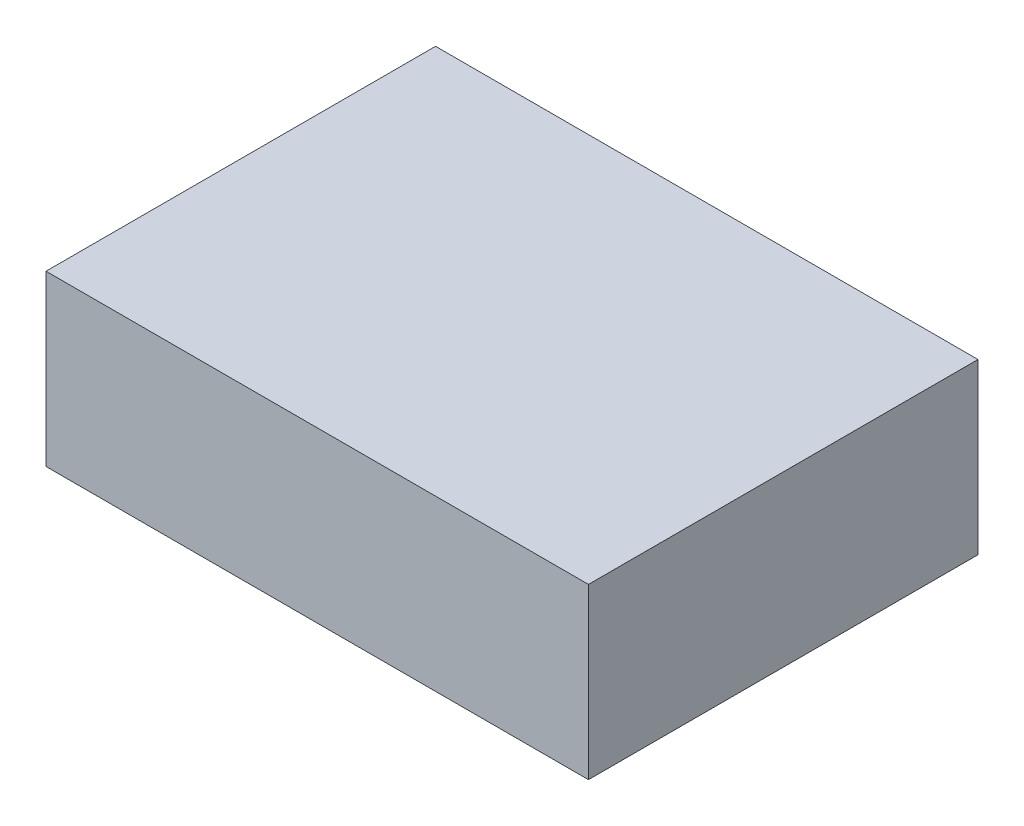
ISO-10303-21;
HEADER;
FILE_DESCRIPTION(('STEP AP214'),'2;1');
FILE_NAME('part.step','',(''),(''),'','','');
FILE_SCHEMA(('AUTOMOTIVE_DESIGN { 1 0 10303 214 1 1 1 1 }'));
ENDSEC;
DATA;
#1=APPLICATION_CONTEXT('core data for automotive mechanical design processes');
#2=APPLICATION_PROTOCOL_DEFINITION('international standard','automotive_design',2000,#1);
#3=PRODUCT_CONTEXT('',#1,'mechanical');
#4=PRODUCT('Part','Part','',(#3));
#5=PRODUCT_RELATED_PRODUCT_CATEGORY('part','',(#4));
#6=PRODUCT_DEFINITION_FORMATION('','',#4);
#7=PRODUCT_DEFINITION_CONTEXT('part definition',#1,'design');
#8=PRODUCT_DEFINITION('design','',#6,#7);
#9=PRODUCT_DEFINITION_SHAPE('','',#8);
#10=(LENGTH_UNIT() NAMED_UNIT(*) SI_UNIT(.MILLI.,.METRE.));
#11=(NAMED_UNIT(*) PLANE_ANGLE_UNIT() SI_UNIT($,.RADIAN.));
#12=(NAMED_UNIT(*) SI_UNIT($,.STERADIAN.) SOLID_ANGLE_UNIT());
#13=UNCERTAINTY_MEASURE_WITH_UNIT(LENGTH_MEASURE(1.E-05),#10,'distance_accuracy_value','');
#14=(GEOMETRIC_REPRESENTATION_CONTEXT(3) GLOBAL_UNCERTAINTY_ASSIGNED_CONTEXT((#13)) GLOBAL_UNIT_ASSIGNED_CONTEXT((#10,
#11,#12)) REPRESENTATION_CONTEXT('',''));
#15=CARTESIAN_POINT('',(0.,0.,0.));
#16=DIRECTION('',(0.,0.,1.));
#17=DIRECTION('',(1.,0.,0.));
#18=AXIS2_PLACEMENT_3D('',#15,#16,#17);
#19=CARTESIAN_POINT('',(-57.7292450853398,45.466,-46.6022930847641));
#20=DIRECTION('',(1.,0.,0.));
#21=DIRECTION('',(0.,0.,-1.));
#22=AXIS2_PLACEMENT_3D('',#19,#20,#21);
#23=PLANE('',#22);
#24=DIRECTION('',(0.,0.,1.));
#25=VECTOR('',#24,1.);
#26=CARTESIAN_POINT('',(-57.7292450853398,0.,-46.6022930847641));
#27=LINE('',#26,#25);
#28=CARTESIAN_POINT('',(-57.7292450853398,0.,-46.6022930847641));
#29=VERTEX_POINT('',#28);
#30=CARTESIAN_POINT('',(-57.7292450853398,0.,58.1219610383013));
#31=VERTEX_POINT('',#30);
#32=EDGE_CURVE('E101',#29,#31,#27,.T.);
#33=ORIENTED_EDGE('',*,*,#32,.T.);
#34=DIRECTION('',(0.,-1.,0.));
#35=VECTOR('',#34,1.);
#36=CARTESIAN_POINT('',(-57.7292450853398,45.466,58.1219610383013));
#37=LINE('',#36,#35);
#38=CARTESIAN_POINT('',(-57.7292450853398,45.466,58.1219610383013));
#39=VERTEX_POINT('',#38);
#40=EDGE_CURVE('E11',#39,#31,#37,.T.);
#41=ORIENTED_EDGE('',*,*,#40,.F.);
#42=DIRECTION('',(0.,0.,1.));
#43=VECTOR('',#42,1.);
#44=CARTESIAN_POINT('',(-57.7292450853398,45.466,-46.6022930847641));
#45=LINE('',#44,#43);
#46=CARTESIAN_POINT('',(-57.7292450853398,45.466,-46.6022930847641));
#47=VERTEX_POINT('',#46);
#48=EDGE_CURVE('E89',#47,#39,#45,.T.);
#49=ORIENTED_EDGE('',*,*,#48,.F.);
#50=DIRECTION('',(0.,-1.,0.));
#51=VECTOR('',#50,1.);
#52=CARTESIAN_POINT('',(-57.7292450853398,45.466,-46.6022930847641));
#53=LINE('',#52,#51);
#54=EDGE_CURVE('E97',#47,#29,#53,.T.);
#55=ORIENTED_EDGE('',*,*,#54,.T.);
#56=EDGE_LOOP('',(#33,#41,#49,#55));
#57=FACE_BOUND('',#56,.T.);
#58=ADVANCED_FACE('F38',(#57),#23,.F.);
#59=CARTESIAN_POINT('',(-57.7292450853398,45.466,58.1219610383013));
#60=DIRECTION('',(0.,0.,-1.));
#61=DIRECTION('',(-1.,0.,0.));
#62=AXIS2_PLACEMENT_3D('',#59,#60,#61);
#63=PLANE('',#62);
#64=DIRECTION('',(1.,0.,0.));
#65=VECTOR('',#64,1.);
#66=CARTESIAN_POINT('',(-57.7292450853398,0.,58.1219610383013));
#67=LINE('',#66,#65);
#68=CARTESIAN_POINT('',(88.0992787810288,0.,58.1219610383013));
#69=VERTEX_POINT('',#68);
#70=EDGE_CURVE('E93',#31,#69,#67,.T.);
#71=ORIENTED_EDGE('',*,*,#70,.T.);
#72=DIRECTION('',(0.,-1.,0.));
#73=VECTOR('',#72,1.);
#74=CARTESIAN_POINT('',(88.0992787810288,45.466,58.1219610383013));
#75=LINE('',#74,#73);
#76=CARTESIAN_POINT('',(88.0992787810288,45.466,58.1219610383013));
#77=VERTEX_POINT('',#76);
#78=EDGE_CURVE('E46',#77,#69,#75,.T.);
#79=ORIENTED_EDGE('',*,*,#78,.F.);
#80=DIRECTION('',(1.,0.,0.));
#81=VECTOR('',#80,1.);
#82=CARTESIAN_POINT('',(-57.7292450853398,45.466,58.1219610383013));
#83=LINE('',#82,#81);
#84=EDGE_CURVE('E84',#39,#77,#83,.T.);
#85=ORIENTED_EDGE('',*,*,#84,.F.);
#86=ORIENTED_EDGE('',*,*,#40,.T.);
#87=EDGE_LOOP('',(#71,#79,#85,#86));
#88=FACE_BOUND('',#87,.T.);
#89=ADVANCED_FACE('F92',(#88),#63,.F.);
#90=CARTESIAN_POINT('',(88.0992787810288,45.466,-46.6022930847641));
#91=DIRECTION('',(-1.,0.,0.));
#92=DIRECTION('',(0.,0.,1.));
#93=AXIS2_PLACEMENT_3D('',#90,#91,#92);
#94=PLANE('',#93);
#95=DIRECTION('',(0.,0.,-1.));
#96=VECTOR('',#95,1.);
#97=CARTESIAN_POINT('',(88.0992787810288,0.,-46.6022930847641));
#98=LINE('',#97,#96);
#99=CARTESIAN_POINT('',(88.0992787810288,0.,-46.6022930847641));
#100=VERTEX_POINT('',#99);
#101=EDGE_CURVE('E71',#69,#100,#98,.T.);
#102=ORIENTED_EDGE('',*,*,#101,.T.);
#103=DIRECTION('',(0.,-1.,0.));
#104=VECTOR('',#103,1.);
#105=CARTESIAN_POINT('',(88.0992787810288,45.466,-46.6022930847641));
#106=LINE('',#105,#104);
#107=CARTESIAN_POINT('',(88.0992787810288,45.466,-46.6022930847641));
#108=VERTEX_POINT('',#107);
#109=EDGE_CURVE('E94',#108,#100,#106,.T.);
#110=ORIENTED_EDGE('',*,*,#109,.F.);
#111=DIRECTION('',(0.,0.,-1.));
#112=VECTOR('',#111,1.);
#113=CARTESIAN_POINT('',(88.0992787810288,45.466,-46.6022930847641));
#114=LINE('',#113,#112);
#115=EDGE_CURVE('E87',#77,#108,#114,.T.);
#116=ORIENTED_EDGE('',*,*,#115,.F.);
#117=ORIENTED_EDGE('',*,*,#78,.T.);
#118=EDGE_LOOP('',(#102,#110,#116,#117));
#119=FACE_BOUND('',#118,.T.);
#120=ADVANCED_FACE('F95',(#119),#94,.F.);
#121=CARTESIAN_POINT('',(-57.7292450853398,45.466,-46.6022930847641));
#122=DIRECTION('',(0.,0.,1.));
#123=DIRECTION('',(1.,0.,0.));
#124=AXIS2_PLACEMENT_3D('',#121,#122,#123);
#125=PLANE('',#124);
#126=DIRECTION('',(-1.,0.,0.));
#127=VECTOR('',#126,1.);
#128=CARTESIAN_POINT('',(-57.7292450853398,0.,-46.6022930847641));
#129=LINE('',#128,#127);
#130=EDGE_CURVE('E77',#100,#29,#129,.T.);
#131=ORIENTED_EDGE('',*,*,#130,.T.);
#132=ORIENTED_EDGE('',*,*,#54,.F.);
#133=DIRECTION('',(-1.,0.,0.));
#134=VECTOR('',#133,1.);
#135=CARTESIAN_POINT('',(-57.7292450853398,45.466,-46.6022930847641));
#136=LINE('',#135,#134);
#137=EDGE_CURVE('E54',#108,#47,#136,.T.);
#138=ORIENTED_EDGE('',*,*,#137,.F.);
#139=ORIENTED_EDGE('',*,*,#109,.T.);
#140=EDGE_LOOP('',(#131,#132,#138,#139));
#141=FACE_BOUND('',#140,.T.);
#142=ADVANCED_FACE('F108',(#141),#125,.F.);
#143=CARTESIAN_POINT('',(0.,45.466,0.));
#144=DIRECTION('',(0.,1.,0.));
#145=DIRECTION('',(0.,0.,1.));
#146=AXIS2_PLACEMENT_3D('',#143,#144,#145);
#147=PLANE('',#146);
#148=ORIENTED_EDGE('',*,*,#48,.T.);
#149=ORIENTED_EDGE('',*,*,#84,.T.);
#150=ORIENTED_EDGE('',*,*,#115,.T.);
#151=ORIENTED_EDGE('',*,*,#137,.T.);
#152=EDGE_LOOP('',(#148,#149,#150,#151));
#153=FACE_BOUND('',#152,.T.);
#154=ADVANCED_FACE('F85',(#153),#147,.T.);
#155=CARTESIAN_POINT('',(0.,0.,0.));
#156=DIRECTION('',(0.,1.,0.));
#157=DIRECTION('',(0.,0.,1.));
#158=AXIS2_PLACEMENT_3D('',#155,#156,#157);
#159=PLANE('',#158);
#160=ORIENTED_EDGE('',*,*,#32,.F.);
#161=ORIENTED_EDGE('',*,*,#130,.F.);
#162=ORIENTED_EDGE('',*,*,#101,.F.);
#163=ORIENTED_EDGE('',*,*,#70,.F.);
#164=EDGE_LOOP('',(#160,#161,#162,#163));
#165=FACE_BOUND('',#164,.T.);
#166=ADVANCED_FACE('F111',(#165),#159,.F.);
#167=CLOSED_SHELL('',(#58,#89,#120,#142,#154,#166));
#168=MANIFOLD_SOLID_BREP('B2',#167);
#169=ADVANCED_BREP_SHAPE_REPRESENTATION('',(#18,#168),#14);
#170=SHAPE_DEFINITION_REPRESENTATION(#9,#169);
ENDSEC;
END-ISO-10303-21;
